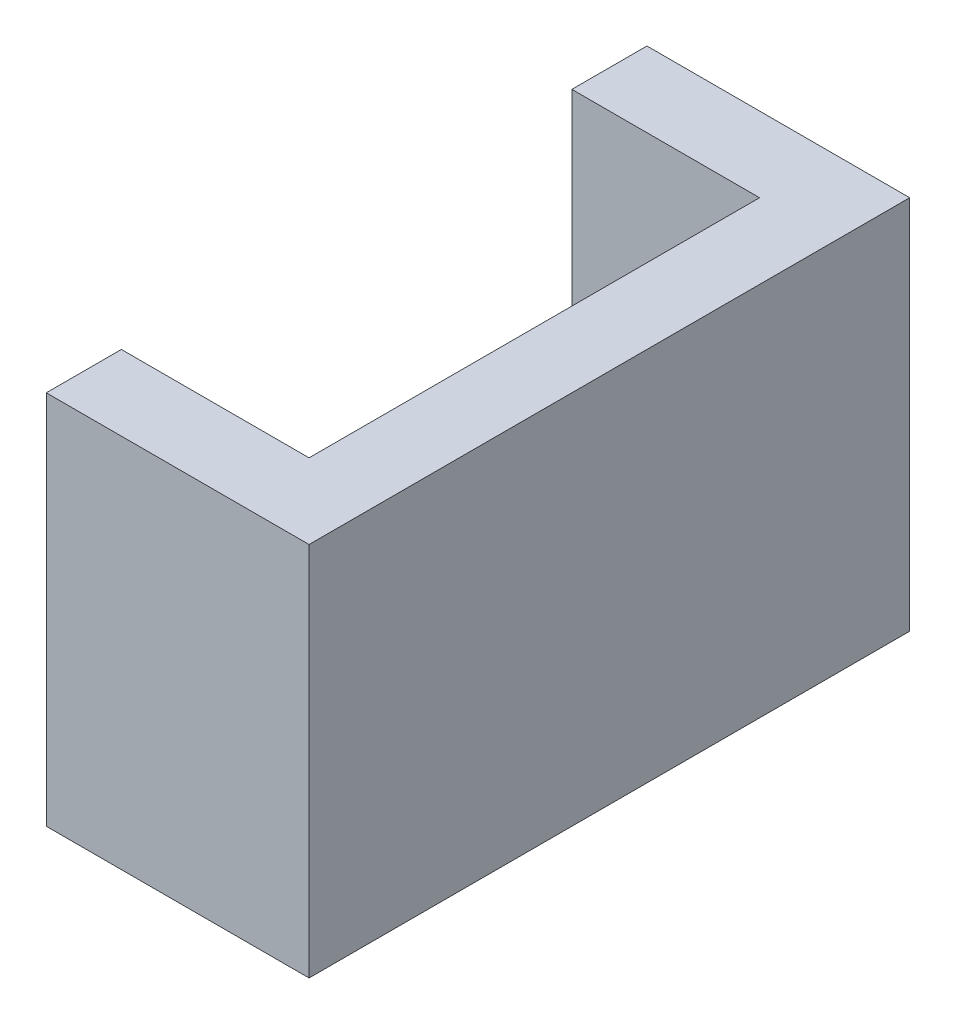
ISO-10303-21;
HEADER;
FILE_DESCRIPTION(('STEP AP214'),'2;1');
FILE_NAME('part.step','',(''),(''),'','','');
FILE_SCHEMA(('AUTOMOTIVE_DESIGN { 1 0 10303 214 1 1 1 1 }'));
ENDSEC;
DATA;
#1=APPLICATION_CONTEXT('core data for automotive mechanical design processes');
#2=APPLICATION_PROTOCOL_DEFINITION('international standard','automotive_design',2000,#1);
#3=PRODUCT_CONTEXT('',#1,'mechanical');
#4=PRODUCT('Part','Part','',(#3));
#5=PRODUCT_RELATED_PRODUCT_CATEGORY('part','',(#4));
#6=PRODUCT_DEFINITION_FORMATION('','',#4);
#7=PRODUCT_DEFINITION_CONTEXT('part definition',#1,'design');
#8=PRODUCT_DEFINITION('design','',#6,#7);
#9=PRODUCT_DEFINITION_SHAPE('','',#8);
#10=(LENGTH_UNIT() NAMED_UNIT(*) SI_UNIT(.MILLI.,.METRE.));
#11=(NAMED_UNIT(*) PLANE_ANGLE_UNIT() SI_UNIT($,.RADIAN.));
#12=(NAMED_UNIT(*) SI_UNIT($,.STERADIAN.) SOLID_ANGLE_UNIT());
#13=UNCERTAINTY_MEASURE_WITH_UNIT(LENGTH_MEASURE(1.E-05),#10,'distance_accuracy_value','');
#14=(GEOMETRIC_REPRESENTATION_CONTEXT(3) GLOBAL_UNCERTAINTY_ASSIGNED_CONTEXT((#13)) GLOBAL_UNIT_ASSIGNED_CONTEXT((#10,
#11,#12)) REPRESENTATION_CONTEXT('',''));
#15=CARTESIAN_POINT('',(0.,0.,0.));
#16=DIRECTION('',(0.,0.,1.));
#17=DIRECTION('',(1.,0.,0.));
#18=AXIS2_PLACEMENT_3D('',#15,#16,#17);
#19=CARTESIAN_POINT('',(0.,0.,0.));
#20=DIRECTION('',(1.,0.,0.));
#21=DIRECTION('',(0.,0.,-1.));
#22=AXIS2_PLACEMENT_3D('',#19,#20,#21);
#23=PLANE('',#22);
#24=DIRECTION('',(0.,0.,1.));
#25=VECTOR('',#24,1.);
#26=CARTESIAN_POINT('',(0.,4.14457831325301,7.15180722891566));
#27=LINE('',#26,#25);
#28=CARTESIAN_POINT('',(0.,4.14457831325301,5.15180722891566));
#29=VERTEX_POINT('',#28);
#30=CARTESIAN_POINT('',(0.,4.14457831325301,7.15180722891566));
#31=VERTEX_POINT('',#30);
#32=EDGE_CURVE('E85',#29,#31,#27,.T.);
#33=ORIENTED_EDGE('',*,*,#32,.F.);
#34=DIRECTION('',(0.,-1.,0.));
#35=VECTOR('',#34,1.);
#36=CARTESIAN_POINT('',(0.,17.144578313253,5.15180722891566));
#37=LINE('',#36,#35);
#38=CARTESIAN_POINT('',(0.,-5.85542168674699,5.15180722891566));
#39=VERTEX_POINT('',#38);
#40=EDGE_CURVE('E182',#29,#39,#37,.T.);
#41=ORIENTED_EDGE('',*,*,#40,.T.);
#42=DIRECTION('',(0.,0.,-1.));
#43=VECTOR('',#42,1.);
#44=CARTESIAN_POINT('',(0.,-5.85542168674699,7.15180722891566));
#45=LINE('',#44,#43);
#46=CARTESIAN_POINT('',(0.,-5.85542168674699,7.15180722891566));
#47=VERTEX_POINT('',#46);
#48=EDGE_CURVE('E139',#47,#39,#45,.T.);
#49=ORIENTED_EDGE('',*,*,#48,.F.);
#50=DIRECTION('',(0.,-1.,0.));
#51=VECTOR('',#50,1.);
#52=CARTESIAN_POINT('',(0.,4.14457831325301,7.15180722891566));
#53=LINE('',#52,#51);
#54=EDGE_CURVE('E140',#31,#47,#53,.T.);
#55=ORIENTED_EDGE('',*,*,#54,.F.);
#56=EDGE_LOOP('',(#33,#41,#49,#55));
#57=FACE_BOUND('',#56,.T.);
#58=ADVANCED_FACE('F39',(#57),#23,.F.);
#59=CARTESIAN_POINT('',(7.,4.14457831325301,7.15180722891566));
#60=DIRECTION('',(0.,0.,-1.));
#61=DIRECTION('',(0.,1.,0.));
#62=AXIS2_PLACEMENT_3D('',#59,#60,#61);
#63=PLANE('',#62);
#64=ORIENTED_EDGE('',*,*,#54,.T.);
#65=DIRECTION('',(-1.,0.,0.));
#66=VECTOR('',#65,1.);
#67=CARTESIAN_POINT('',(7.,-5.85542168674699,7.15180722891566));
#68=LINE('',#67,#66);
#69=CARTESIAN_POINT('',(7.,-5.85542168674699,7.15180722891566));
#70=VERTEX_POINT('',#69);
#71=EDGE_CURVE('E11',#70,#47,#68,.T.);
#72=ORIENTED_EDGE('',*,*,#71,.F.);
#73=DIRECTION('',(0.,-1.,0.));
#74=VECTOR('',#73,1.);
#75=CARTESIAN_POINT('',(7.,4.14457831325301,7.15180722891566));
#76=LINE('',#75,#74);
#77=CARTESIAN_POINT('',(7.,4.14457831325301,7.15180722891566));
#78=VERTEX_POINT('',#77);
#79=EDGE_CURVE('E153',#78,#70,#76,.T.);
#80=ORIENTED_EDGE('',*,*,#79,.F.);
#81=DIRECTION('',(-1.,0.,0.));
#82=VECTOR('',#81,1.);
#83=CARTESIAN_POINT('',(7.,4.14457831325301,7.15180722891566));
#84=LINE('',#83,#82);
#85=EDGE_CURVE('E154',#78,#31,#84,.T.);
#86=ORIENTED_EDGE('',*,*,#85,.T.);
#87=EDGE_LOOP('',(#64,#72,#80,#86));
#88=FACE_BOUND('',#87,.T.);
#89=ADVANCED_FACE('F41',(#88),#63,.F.);
#90=CARTESIAN_POINT('',(7.,-5.85542168674699,7.15180722891566));
#91=DIRECTION('',(0.,1.,0.));
#92=DIRECTION('',(0.,0.,1.));
#93=AXIS2_PLACEMENT_3D('',#90,#91,#92);
#94=PLANE('',#93);
#95=ORIENTED_EDGE('',*,*,#48,.T.);
#96=DIRECTION('',(-1.,0.,0.));
#97=VECTOR('',#96,1.);
#98=CARTESIAN_POINT('',(0.,-5.85542168674699,5.15180722891566));
#99=LINE('',#98,#97);
#100=CARTESIAN_POINT('',(5.,-5.85542168674699,5.15180722891566));
#101=VERTEX_POINT('',#100);
#102=EDGE_CURVE('E124',#101,#39,#99,.T.);
#103=ORIENTED_EDGE('',*,*,#102,.F.);
#104=DIRECTION('',(0.,0.,1.));
#105=VECTOR('',#104,1.);
#106=CARTESIAN_POINT('',(5.,-5.85542168674699,5.15180722891566));
#107=LINE('',#106,#105);
#108=CARTESIAN_POINT('',(5.,-5.85542168674699,-6.84819277108434));
#109=VERTEX_POINT('',#108);
#110=EDGE_CURVE('E132',#109,#101,#107,.T.);
#111=ORIENTED_EDGE('',*,*,#110,.F.);
#112=DIRECTION('',(1.,0.,0.));
#113=VECTOR('',#112,1.);
#114=CARTESIAN_POINT('',(0.,-5.85542168674699,-6.84819277108434));
#115=LINE('',#114,#113);
#116=CARTESIAN_POINT('',(0.,-5.85542168674699,-6.84819277108434));
#117=VERTEX_POINT('',#116);
#118=EDGE_CURVE('E116',#117,#109,#115,.T.);
#119=ORIENTED_EDGE('',*,*,#118,.F.);
#120=CARTESIAN_POINT('',(0.,-5.85542168674699,-8.84819277108434));
#121=VERTEX_POINT('',#120);
#122=EDGE_CURVE('E128',#117,#121,#45,.T.);
#123=ORIENTED_EDGE('',*,*,#122,.T.);
#124=DIRECTION('',(-1.,0.,0.));
#125=VECTOR('',#124,1.);
#126=CARTESIAN_POINT('',(7.,-5.85542168674699,-8.84819277108434));
#127=LINE('',#126,#125);
#128=CARTESIAN_POINT('',(7.,-5.85542168674699,-8.84819277108434));
#129=VERTEX_POINT('',#128);
#130=EDGE_CURVE('E48',#129,#121,#127,.T.);
#131=ORIENTED_EDGE('',*,*,#130,.F.);
#132=DIRECTION('',(0.,0.,-1.));
#133=VECTOR('',#132,1.);
#134=CARTESIAN_POINT('',(7.,-5.85542168674699,7.15180722891566));
#135=LINE('',#134,#133);
#136=EDGE_CURVE('E92',#70,#129,#135,.T.);
#137=ORIENTED_EDGE('',*,*,#136,.F.);
#138=ORIENTED_EDGE('',*,*,#71,.T.);
#139=EDGE_LOOP('',(#95,#103,#111,#119,#123,#131,#137,#138));
#140=FACE_BOUND('',#139,.T.);
#141=ADVANCED_FACE('F127',(#140),#94,.F.);
#142=CARTESIAN_POINT('',(7.,4.14457831325301,-8.84819277108434));
#143=DIRECTION('',(0.,0.,1.));
#144=DIRECTION('',(0.,-1.,0.));
#145=AXIS2_PLACEMENT_3D('',#142,#143,#144);
#146=PLANE('',#145);
#147=DIRECTION('',(0.,1.,0.));
#148=VECTOR('',#147,1.);
#149=CARTESIAN_POINT('',(0.,4.14457831325301,-8.84819277108434));
#150=LINE('',#149,#148);
#151=CARTESIAN_POINT('',(0.,4.14457831325301,-8.84819277108434));
#152=VERTEX_POINT('',#151);
#153=EDGE_CURVE('E137',#121,#152,#150,.T.);
#154=ORIENTED_EDGE('',*,*,#153,.T.);
#155=DIRECTION('',(-1.,0.,0.));
#156=VECTOR('',#155,1.);
#157=CARTESIAN_POINT('',(7.,4.14457831325301,-8.84819277108434));
#158=LINE('',#157,#156);
#159=CARTESIAN_POINT('',(7.,4.14457831325301,-8.84819277108434));
#160=VERTEX_POINT('',#159);
#161=EDGE_CURVE('E157',#160,#152,#158,.T.);
#162=ORIENTED_EDGE('',*,*,#161,.F.);
#163=DIRECTION('',(0.,1.,0.));
#164=VECTOR('',#163,1.);
#165=CARTESIAN_POINT('',(7.,4.14457831325301,-8.84819277108434));
#166=LINE('',#165,#164);
#167=EDGE_CURVE('E165',#129,#160,#166,.T.);
#168=ORIENTED_EDGE('',*,*,#167,.F.);
#169=ORIENTED_EDGE('',*,*,#130,.T.);
#170=EDGE_LOOP('',(#154,#162,#168,#169));
#171=FACE_BOUND('',#170,.T.);
#172=ADVANCED_FACE('F163',(#171),#146,.F.);
#173=CARTESIAN_POINT('',(7.,4.14457831325301,7.15180722891566));
#174=DIRECTION('',(0.,-1.,0.));
#175=DIRECTION('',(0.,0.,-1.));
#176=AXIS2_PLACEMENT_3D('',#173,#174,#175);
#177=PLANE('',#176);
#178=DIRECTION('',(0.,0.,-1.));
#179=VECTOR('',#178,1.);
#180=CARTESIAN_POINT('',(5.,4.14457831325301,5.15180722891566));
#181=LINE('',#180,#179);
#182=CARTESIAN_POINT('',(5.,4.14457831325301,5.15180722891566));
#183=VERTEX_POINT('',#182);
#184=CARTESIAN_POINT('',(5.,4.14457831325301,-6.84819277108434));
#185=VERTEX_POINT('',#184);
#186=EDGE_CURVE('E186',#183,#185,#181,.T.);
#187=ORIENTED_EDGE('',*,*,#186,.F.);
#188=DIRECTION('',(1.,0.,0.));
#189=VECTOR('',#188,1.);
#190=CARTESIAN_POINT('',(0.,4.14457831325301,5.15180722891566));
#191=LINE('',#190,#189);
#192=EDGE_CURVE('E175',#29,#183,#191,.T.);
#193=ORIENTED_EDGE('',*,*,#192,.F.);
#194=ORIENTED_EDGE('',*,*,#32,.T.);
#195=ORIENTED_EDGE('',*,*,#85,.F.);
#196=DIRECTION('',(0.,0.,1.));
#197=VECTOR('',#196,1.);
#198=CARTESIAN_POINT('',(7.,4.14457831325301,7.15180722891566));
#199=LINE('',#198,#197);
#200=EDGE_CURVE('E64',#160,#78,#199,.T.);
#201=ORIENTED_EDGE('',*,*,#200,.F.);
#202=ORIENTED_EDGE('',*,*,#161,.T.);
#203=CARTESIAN_POINT('',(0.,4.14457831325301,-6.84819277108434));
#204=VERTEX_POINT('',#203);
#205=EDGE_CURVE('E150',#152,#204,#27,.T.);
#206=ORIENTED_EDGE('',*,*,#205,.T.);
#207=DIRECTION('',(-1.,0.,0.));
#208=VECTOR('',#207,1.);
#209=CARTESIAN_POINT('',(0.,4.14457831325301,-6.84819277108434));
#210=LINE('',#209,#208);
#211=EDGE_CURVE('E55',#185,#204,#210,.T.);
#212=ORIENTED_EDGE('',*,*,#211,.F.);
#213=EDGE_LOOP('',(#187,#193,#194,#195,#201,#202,#206,#212));
#214=FACE_BOUND('',#213,.T.);
#215=ADVANCED_FACE('F198',(#214),#177,.F.);
#216=CARTESIAN_POINT('',(7.,0.,0.));
#217=DIRECTION('',(1.,0.,0.));
#218=DIRECTION('',(0.,0.,-1.));
#219=AXIS2_PLACEMENT_3D('',#216,#217,#218);
#220=PLANE('',#219);
#221=ORIENTED_EDGE('',*,*,#79,.T.);
#222=ORIENTED_EDGE('',*,*,#136,.T.);
#223=ORIENTED_EDGE('',*,*,#167,.T.);
#224=ORIENTED_EDGE('',*,*,#200,.T.);
#225=EDGE_LOOP('',(#221,#222,#223,#224));
#226=FACE_BOUND('',#225,.T.);
#227=ADVANCED_FACE('F203',(#226),#220,.T.);
#228=ORIENTED_EDGE('',*,*,#122,.F.);
#229=DIRECTION('',(0.,-1.,0.));
#230=VECTOR('',#229,1.);
#231=CARTESIAN_POINT('',(0.,17.144578313253,-6.84819277108434));
#232=LINE('',#231,#230);
#233=EDGE_CURVE('E113',#204,#117,#232,.T.);
#234=ORIENTED_EDGE('',*,*,#233,.F.);
#235=ORIENTED_EDGE('',*,*,#205,.F.);
#236=ORIENTED_EDGE('',*,*,#153,.F.);
#237=EDGE_LOOP('',(#228,#234,#235,#236));
#238=FACE_BOUND('',#237,.T.);
#239=ADVANCED_FACE('F136',(#238),#23,.F.);
#240=CARTESIAN_POINT('',(0.,17.144578313253,5.15180722891566));
#241=DIRECTION('',(0.,0.,1.));
#242=DIRECTION('',(1.,0.,0.));
#243=AXIS2_PLACEMENT_3D('',#240,#241,#242);
#244=PLANE('',#243);
#245=ORIENTED_EDGE('',*,*,#192,.T.);
#246=DIRECTION('',(0.,-1.,0.));
#247=VECTOR('',#246,1.);
#248=CARTESIAN_POINT('',(5.,17.144578313253,5.15180722891566));
#249=LINE('',#248,#247);
#250=EDGE_CURVE('E179',#183,#101,#249,.T.);
#251=ORIENTED_EDGE('',*,*,#250,.T.);
#252=ORIENTED_EDGE('',*,*,#102,.T.);
#253=ORIENTED_EDGE('',*,*,#40,.F.);
#254=EDGE_LOOP('',(#245,#251,#252,#253));
#255=FACE_BOUND('',#254,.T.);
#256=ADVANCED_FACE('F210',(#255),#244,.F.);
#257=CARTESIAN_POINT('',(5.,17.144578313253,5.15180722891566));
#258=DIRECTION('',(1.,0.,0.));
#259=DIRECTION('',(0.,0.,-1.));
#260=AXIS2_PLACEMENT_3D('',#257,#258,#259);
#261=PLANE('',#260);
#262=ORIENTED_EDGE('',*,*,#186,.T.);
#263=DIRECTION('',(0.,-1.,0.));
#264=VECTOR('',#263,1.);
#265=CARTESIAN_POINT('',(5.,17.144578313253,-6.84819277108434));
#266=LINE('',#265,#264);
#267=EDGE_CURVE('E123',#185,#109,#266,.T.);
#268=ORIENTED_EDGE('',*,*,#267,.T.);
#269=ORIENTED_EDGE('',*,*,#110,.T.);
#270=ORIENTED_EDGE('',*,*,#250,.F.);
#271=EDGE_LOOP('',(#262,#268,#269,#270));
#272=FACE_BOUND('',#271,.T.);
#273=ADVANCED_FACE('F197',(#272),#261,.F.);
#274=CARTESIAN_POINT('',(0.,17.144578313253,-6.84819277108434));
#275=DIRECTION('',(0.,0.,-1.));
#276=DIRECTION('',(-1.,0.,0.));
#277=AXIS2_PLACEMENT_3D('',#274,#275,#276);
#278=PLANE('',#277);
#279=ORIENTED_EDGE('',*,*,#211,.T.);
#280=ORIENTED_EDGE('',*,*,#233,.T.);
#281=ORIENTED_EDGE('',*,*,#118,.T.);
#282=ORIENTED_EDGE('',*,*,#267,.F.);
#283=EDGE_LOOP('',(#279,#280,#281,#282));
#284=FACE_BOUND('',#283,.T.);
#285=ADVANCED_FACE('F115',(#284),#278,.F.);
#286=CLOSED_SHELL('',(#58,#89,#141,#172,#215,#227,#239,#256,#273,#285));
#287=MANIFOLD_SOLID_BREP('B2',#286);
#288=ADVANCED_BREP_SHAPE_REPRESENTATION('',(#18,#287),#14);
#289=SHAPE_DEFINITION_REPRESENTATION(#9,#288);
ENDSEC;
END-ISO-10303-21;
